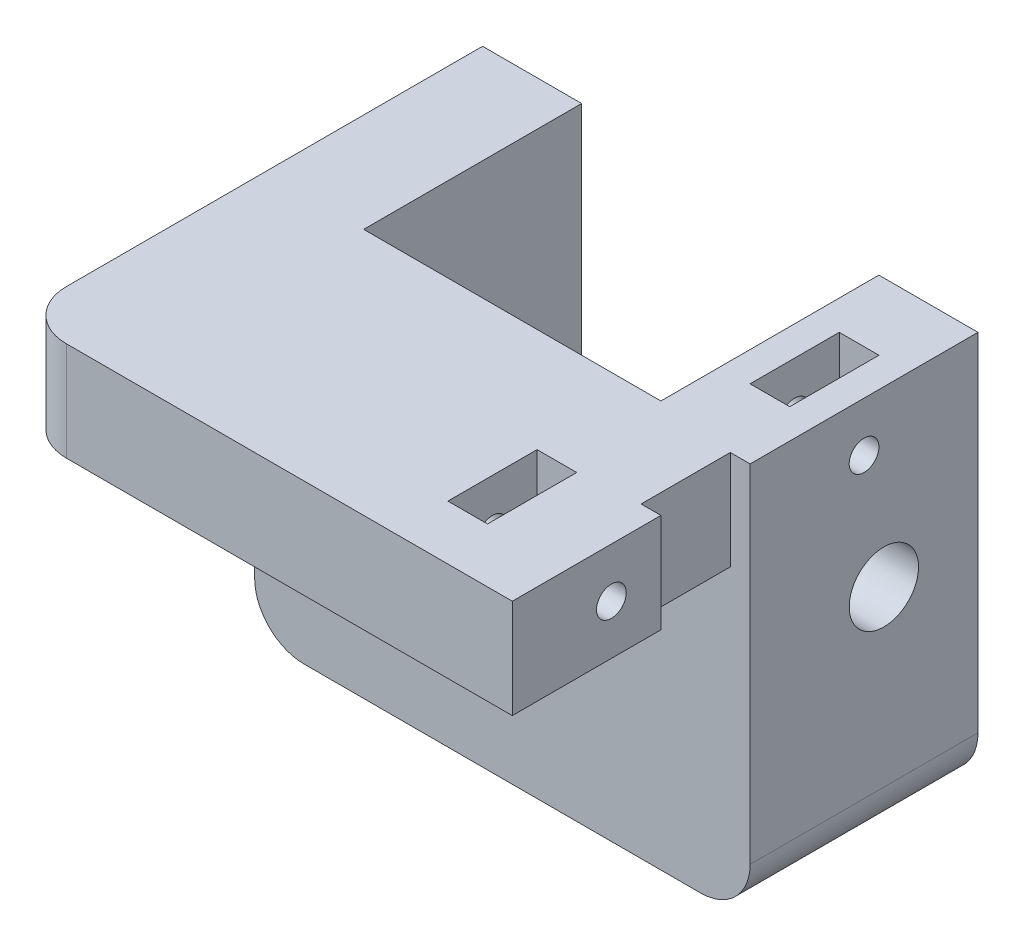
ISO-10303-21;
HEADER;
FILE_DESCRIPTION(('STEP AP214'),'2;1');
FILE_NAME('part.step','',(''),(''),'','','');
FILE_SCHEMA(('AUTOMOTIVE_DESIGN { 1 0 10303 214 1 1 1 1 }'));
ENDSEC;
DATA;
#1=APPLICATION_CONTEXT('core data for automotive mechanical design processes');
#2=APPLICATION_PROTOCOL_DEFINITION('international standard','automotive_design',2000,#1);
#3=PRODUCT_CONTEXT('',#1,'mechanical');
#4=PRODUCT('Part','Part','',(#3));
#5=PRODUCT_RELATED_PRODUCT_CATEGORY('part','',(#4));
#6=PRODUCT_DEFINITION_FORMATION('','',#4);
#7=PRODUCT_DEFINITION_CONTEXT('part definition',#1,'design');
#8=PRODUCT_DEFINITION('design','',#6,#7);
#9=PRODUCT_DEFINITION_SHAPE('','',#8);
#10=(LENGTH_UNIT() NAMED_UNIT(*) SI_UNIT(.MILLI.,.METRE.));
#11=(NAMED_UNIT(*) PLANE_ANGLE_UNIT() SI_UNIT($,.RADIAN.));
#12=(NAMED_UNIT(*) SI_UNIT($,.STERADIAN.) SOLID_ANGLE_UNIT());
#13=UNCERTAINTY_MEASURE_WITH_UNIT(LENGTH_MEASURE(1.E-05),#10,'distance_accuracy_value','');
#14=(GEOMETRIC_REPRESENTATION_CONTEXT(3) GLOBAL_UNCERTAINTY_ASSIGNED_CONTEXT((#13)) GLOBAL_UNIT_ASSIGNED_CONTEXT((#10,
#11,#12)) REPRESENTATION_CONTEXT('',''));
#15=CARTESIAN_POINT('',(0.,0.,0.));
#16=DIRECTION('',(0.,0.,1.));
#17=DIRECTION('',(1.,0.,0.));
#18=AXIS2_PLACEMENT_3D('',#15,#16,#17);
#19=CARTESIAN_POINT('',(21.,25.,11.5));
#20=DIRECTION('',(1.,0.,0.));
#21=DIRECTION('',(0.,0.,-1.));
#22=AXIS2_PLACEMENT_3D('',#19,#20,#21);
#23=CYLINDRICAL_SURFACE('',#22,1.5);
#24=CARTESIAN_POINT('',(37.0024157262878,25.,11.5));
#25=DIRECTION('',(1.,0.,0.));
#26=DIRECTION('',(0.,0.,-1.));
#27=AXIS2_PLACEMENT_3D('',#24,#25,#26);
#28=CIRCLE('',#27,1.5);
#29=CARTESIAN_POINT('',(37.0024157262878,25.,10.));
#30=VERTEX_POINT('',#29);
#31=EDGE_CURVE('E36',#30,#30,#28,.F.);
#32=ORIENTED_EDGE('',*,*,#31,.T.);
#33=EDGE_LOOP('',(#32));
#34=FACE_BOUND('',#33,.T.);
#35=CARTESIAN_POINT('',(40.,25.,11.5));
#36=DIRECTION('',(1.,0.,0.));
#37=DIRECTION('',(0.,0.,-1.));
#38=AXIS2_PLACEMENT_3D('',#35,#36,#37);
#39=CIRCLE('',#38,1.5);
#40=CARTESIAN_POINT('',(40.,25.,10.));
#41=VERTEX_POINT('',#40);
#42=EDGE_CURVE('E234',#41,#41,#39,.T.);
#43=ORIENTED_EDGE('',*,*,#42,.T.);
#44=EDGE_LOOP('',(#43));
#45=FACE_BOUND('',#44,.T.);
#46=ADVANCED_FACE('F32',(#34,#45),#23,.F.);
#47=CARTESIAN_POINT('',(-5.,30.,42.));
#48=DIRECTION('',(0.,-1.,0.));
#49=DIRECTION('',(1.,0.,0.));
#50=AXIS2_PLACEMENT_3D('',#47,#48,#49);
#51=CYLINDRICAL_SURFACE('',#50,5.);
#52=DIRECTION('',(0.,1.,0.));
#53=VECTOR('',#52,1.);
#54=CARTESIAN_POINT('',(-10.,30.,42.));
#55=LINE('',#54,#53);
#56=CARTESIAN_POINT('',(-10.,20.,42.));
#57=VERTEX_POINT('',#56);
#58=CARTESIAN_POINT('',(-10.,30.,42.));
#59=VERTEX_POINT('',#58);
#60=EDGE_CURVE('E402',#57,#59,#55,.T.);
#61=ORIENTED_EDGE('',*,*,#60,.F.);
#62=CARTESIAN_POINT('',(-5.,20.,42.));
#63=DIRECTION('',(0.,1.,0.));
#64=DIRECTION('',(0.,0.,1.));
#65=AXIS2_PLACEMENT_3D('',#62,#63,#64);
#66=CIRCLE('',#65,5.);
#67=CARTESIAN_POINT('',(-5.,20.,47.));
#68=VERTEX_POINT('',#67);
#69=EDGE_CURVE('E41',#68,#57,#66,.F.);
#70=ORIENTED_EDGE('',*,*,#69,.F.);
#71=DIRECTION('',(0.,1.,0.));
#72=VECTOR('',#71,1.);
#73=CARTESIAN_POINT('',(-5.,30.,47.));
#74=LINE('',#73,#72);
#75=CARTESIAN_POINT('',(-5.,30.,47.));
#76=VERTEX_POINT('',#75);
#77=EDGE_CURVE('E405',#76,#68,#74,.F.);
#78=ORIENTED_EDGE('',*,*,#77,.F.);
#79=CARTESIAN_POINT('',(-5.,30.,42.));
#80=DIRECTION('',(0.,-1.,0.));
#81=DIRECTION('',(1.,0.,0.));
#82=AXIS2_PLACEMENT_3D('',#79,#80,#81);
#83=CIRCLE('',#82,5.);
#84=EDGE_CURVE('E11',#59,#76,#83,.F.);
#85=ORIENTED_EDGE('',*,*,#84,.F.);
#86=EDGE_LOOP('',(#61,#70,#78,#85));
#87=FACE_BOUND('',#86,.T.);
#88=ADVANCED_FACE('F34',(#87),#51,.T.);
#89=CARTESIAN_POINT('',(-5.,-5.,22.));
#90=DIRECTION('',(0.,0.,1.));
#91=DIRECTION('',(1.,0.,0.));
#92=AXIS2_PLACEMENT_3D('',#89,#90,#91);
#93=CYLINDRICAL_SURFACE('',#92,5.);
#94=DIRECTION('',(0.,0.,1.));
#95=VECTOR('',#94,1.);
#96=CARTESIAN_POINT('',(-9.99999999999999,-5.,22.));
#97=LINE('',#96,#95);
#98=CARTESIAN_POINT('',(-9.99999999999999,-5.,0.));
#99=VERTEX_POINT('',#98);
#100=CARTESIAN_POINT('',(-9.99999999999999,-5.00000000000001,23.));
#101=VERTEX_POINT('',#100);
#102=EDGE_CURVE('E392',#99,#101,#97,.T.);
#103=ORIENTED_EDGE('',*,*,#102,.F.);
#104=CARTESIAN_POINT('',(-5.,-5.,0.));
#105=DIRECTION('',(0.,0.,1.));
#106=DIRECTION('',(1.,0.,0.));
#107=AXIS2_PLACEMENT_3D('',#104,#105,#106);
#108=CIRCLE('',#107,5.);
#109=CARTESIAN_POINT('',(-5.,-10.,0.));
#110=VERTEX_POINT('',#109);
#111=EDGE_CURVE('E398',#110,#99,#108,.F.);
#112=ORIENTED_EDGE('',*,*,#111,.F.);
#113=DIRECTION('',(0.,0.,1.));
#114=VECTOR('',#113,1.);
#115=CARTESIAN_POINT('',(-5.,-10.,22.));
#116=LINE('',#115,#114);
#117=CARTESIAN_POINT('',(-4.99999999999998,-10.,23.));
#118=VERTEX_POINT('',#117);
#119=EDGE_CURVE('E395',#118,#110,#116,.F.);
#120=ORIENTED_EDGE('',*,*,#119,.F.);
#121=CARTESIAN_POINT('',(-5.,-5.,23.));
#122=DIRECTION('',(0.,0.,-1.));
#123=DIRECTION('',(-1.,0.,0.));
#124=AXIS2_PLACEMENT_3D('',#121,#122,#123);
#125=CIRCLE('',#124,5.);
#126=EDGE_CURVE('E400',#101,#118,#125,.F.);
#127=ORIENTED_EDGE('',*,*,#126,.F.);
#128=EDGE_LOOP('',(#103,#112,#120,#127));
#129=FACE_BOUND('',#128,.T.);
#130=ADVANCED_FACE('F437',(#129),#93,.T.);
#131=CARTESIAN_POINT('',(35.,-5.00000000000001,22.));
#132=DIRECTION('',(0.,0.,-1.));
#133=DIRECTION('',(-1.,0.,0.));
#134=AXIS2_PLACEMENT_3D('',#131,#132,#133);
#135=CYLINDRICAL_SURFACE('',#134,5.);
#136=DIRECTION('',(0.,0.,-1.));
#137=VECTOR('',#136,1.);
#138=CARTESIAN_POINT('',(40.,-5.00000000000001,22.));
#139=LINE('',#138,#137);
#140=CARTESIAN_POINT('',(40.,-5.00000000000001,23.));
#141=VERTEX_POINT('',#140);
#142=CARTESIAN_POINT('',(40.,-5.00000000000001,0.));
#143=VERTEX_POINT('',#142);
#144=EDGE_CURVE('E377',#141,#143,#139,.T.);
#145=ORIENTED_EDGE('',*,*,#144,.F.);
#146=CARTESIAN_POINT('',(35.,-5.00000000000001,23.));
#147=DIRECTION('',(0.,0.,-1.));
#148=DIRECTION('',(-1.,0.,0.));
#149=AXIS2_PLACEMENT_3D('',#146,#147,#148);
#150=CIRCLE('',#149,5.);
#151=CARTESIAN_POINT('',(35.,-10.,23.));
#152=VERTEX_POINT('',#151);
#153=EDGE_CURVE('E387',#152,#141,#150,.F.);
#154=ORIENTED_EDGE('',*,*,#153,.F.);
#155=DIRECTION('',(0.,0.,-1.));
#156=VECTOR('',#155,1.);
#157=CARTESIAN_POINT('',(35.,-10.,22.));
#158=LINE('',#157,#156);
#159=CARTESIAN_POINT('',(35.,-10.,0.));
#160=VERTEX_POINT('',#159);
#161=EDGE_CURVE('E384',#160,#152,#158,.F.);
#162=ORIENTED_EDGE('',*,*,#161,.F.);
#163=CARTESIAN_POINT('',(35.,-5.00000000000001,0.));
#164=DIRECTION('',(0.,0.,1.));
#165=DIRECTION('',(1.,0.,0.));
#166=AXIS2_PLACEMENT_3D('',#163,#164,#165);
#167=CIRCLE('',#166,5.);
#168=EDGE_CURVE('E389',#143,#160,#167,.F.);
#169=ORIENTED_EDGE('',*,*,#168,.F.);
#170=EDGE_LOOP('',(#145,#154,#162,#169));
#171=FACE_BOUND('',#170,.T.);
#172=ADVANCED_FACE('F526',(#171),#135,.T.);
#173=CARTESIAN_POINT('',(25.,25.,37.));
#174=DIRECTION('',(1.,0.,0.));
#175=DIRECTION('',(0.,0.,-1.));
#176=AXIS2_PLACEMENT_3D('',#173,#174,#175);
#177=CYLINDRICAL_SURFACE('',#176,1.5);
#178=CARTESIAN_POINT('',(32.,25.,37.));
#179=DIRECTION('',(1.,0.,0.));
#180=DIRECTION('',(0.,0.,-1.));
#181=AXIS2_PLACEMENT_3D('',#178,#179,#180);
#182=CIRCLE('',#181,1.5);
#183=CARTESIAN_POINT('',(32.,25.,35.5));
#184=VERTEX_POINT('',#183);
#185=EDGE_CURVE('E272',#184,#184,#182,.F.);
#186=ORIENTED_EDGE('',*,*,#185,.T.);
#187=EDGE_LOOP('',(#186));
#188=FACE_BOUND('',#187,.T.);
#189=CARTESIAN_POINT('',(40.,25.,37.));
#190=DIRECTION('',(1.,0.,0.));
#191=DIRECTION('',(0.,0.,-1.));
#192=AXIS2_PLACEMENT_3D('',#189,#190,#191);
#193=CIRCLE('',#192,1.5);
#194=CARTESIAN_POINT('',(40.,25.,35.5));
#195=VERTEX_POINT('',#194);
#196=EDGE_CURVE('E282',#195,#195,#193,.T.);
#197=ORIENTED_EDGE('',*,*,#196,.T.);
#198=EDGE_LOOP('',(#197));
#199=FACE_BOUND('',#198,.T.);
#200=ADVANCED_FACE('F469',(#188,#199),#177,.F.);
#201=CARTESIAN_POINT('',(-10.,20.,47.));
#202=DIRECTION('',(0.,1.,0.));
#203=DIRECTION('',(0.,0.,1.));
#204=AXIS2_PLACEMENT_3D('',#201,#202,#203);
#205=PLANE('',#204);
#206=DIRECTION('',(1.,0.,0.));
#207=VECTOR('',#206,1.);
#208=CARTESIAN_POINT('',(-10.,20.,41.5));
#209=LINE('',#208,#207);
#210=CARTESIAN_POINT('',(28.,20.,41.5));
#211=VERTEX_POINT('',#210);
#212=CARTESIAN_POINT('',(32.,20.,41.5));
#213=VERTEX_POINT('',#212);
#214=EDGE_CURVE('E279',#211,#213,#209,.T.);
#215=ORIENTED_EDGE('',*,*,#214,.T.);
#216=DIRECTION('',(0.,0.,-1.));
#217=VECTOR('',#216,1.);
#218=CARTESIAN_POINT('',(32.,20.,47.));
#219=LINE('',#218,#217);
#220=CARTESIAN_POINT('',(32.,20.,32.5));
#221=VERTEX_POINT('',#220);
#222=EDGE_CURVE('E273',#213,#221,#219,.T.);
#223=ORIENTED_EDGE('',*,*,#222,.T.);
#224=DIRECTION('',(-1.,0.,0.));
#225=VECTOR('',#224,1.);
#226=CARTESIAN_POINT('',(-10.,20.,32.5));
#227=LINE('',#226,#225);
#228=CARTESIAN_POINT('',(28.,20.,32.5));
#229=VERTEX_POINT('',#228);
#230=EDGE_CURVE('E276',#221,#229,#227,.T.);
#231=ORIENTED_EDGE('',*,*,#230,.T.);
#232=DIRECTION('',(0.,0.,1.));
#233=VECTOR('',#232,1.);
#234=CARTESIAN_POINT('',(28.,20.,47.));
#235=LINE('',#234,#233);
#236=EDGE_CURVE('E269',#229,#211,#235,.T.);
#237=ORIENTED_EDGE('',*,*,#236,.T.);
#238=EDGE_LOOP('',(#215,#223,#231,#237));
#239=FACE_BOUND('',#238,.T.);
#240=DIRECTION('',(1.,0.,0.));
#241=VECTOR('',#240,1.);
#242=CARTESIAN_POINT('',(-10.,20.,47.));
#243=LINE('',#242,#241);
#244=CARTESIAN_POINT('',(40.,20.,47.));
#245=VERTEX_POINT('',#244);
#246=EDGE_CURVE('E328',#68,#245,#243,.T.);
#247=ORIENTED_EDGE('',*,*,#246,.F.);
#248=ORIENTED_EDGE('',*,*,#69,.T.);
#249=DIRECTION('',(0.,0.,-1.));
#250=VECTOR('',#249,1.);
#251=CARTESIAN_POINT('',(-10.,20.,47.));
#252=LINE('',#251,#250);
#253=CARTESIAN_POINT('',(-10.,20.,23.));
#254=VERTEX_POINT('',#253);
#255=EDGE_CURVE('E333',#57,#254,#252,.T.);
#256=ORIENTED_EDGE('',*,*,#255,.T.);
#257=DIRECTION('',(-1.,0.,0.));
#258=VECTOR('',#257,1.);
#259=CARTESIAN_POINT('',(-10.,20.,23.));
#260=LINE('',#259,#258);
#261=CARTESIAN_POINT('',(38.,20.,23.));
#262=VERTEX_POINT('',#261);
#263=EDGE_CURVE('E301',#262,#254,#260,.T.);
#264=ORIENTED_EDGE('',*,*,#263,.F.);
#265=DIRECTION('',(0.,0.,-1.));
#266=VECTOR('',#265,1.);
#267=CARTESIAN_POINT('',(38.,20.,22.));
#268=LINE('',#267,#266);
#269=CARTESIAN_POINT('',(38.,20.,32.));
#270=VERTEX_POINT('',#269);
#271=EDGE_CURVE('E307',#270,#262,#268,.T.);
#272=ORIENTED_EDGE('',*,*,#271,.F.);
#273=DIRECTION('',(-1.,0.,0.));
#274=VECTOR('',#273,1.);
#275=CARTESIAN_POINT('',(40.,20.,32.));
#276=LINE('',#275,#274);
#277=CARTESIAN_POINT('',(40.,20.,32.));
#278=VERTEX_POINT('',#277);
#279=EDGE_CURVE('E304',#278,#270,#276,.T.);
#280=ORIENTED_EDGE('',*,*,#279,.F.);
#281=DIRECTION('',(0.,0.,-1.));
#282=VECTOR('',#281,1.);
#283=CARTESIAN_POINT('',(40.,20.,22.));
#284=LINE('',#283,#282);
#285=EDGE_CURVE('E322',#245,#278,#284,.T.);
#286=ORIENTED_EDGE('',*,*,#285,.F.);
#287=EDGE_LOOP('',(#247,#248,#256,#264,#272,#280,#286));
#288=FACE_BOUND('',#287,.T.);
#289=ADVANCED_FACE('F478',(#239,#288),#205,.F.);
#290=CARTESIAN_POINT('',(38.,60.,22.));
#291=DIRECTION('',(-1.,0.,0.));
#292=DIRECTION('',(0.,0.,1.));
#293=AXIS2_PLACEMENT_3D('',#290,#291,#292);
#294=PLANE('',#293);
#295=DIRECTION('',(0.,-1.,0.));
#296=VECTOR('',#295,1.);
#297=CARTESIAN_POINT('',(38.,20.,23.));
#298=LINE('',#297,#296);
#299=CARTESIAN_POINT('',(38.,30.,23.));
#300=VERTEX_POINT('',#299);
#301=EDGE_CURVE('E298',#300,#262,#298,.T.);
#302=ORIENTED_EDGE('',*,*,#301,.F.);
#303=DIRECTION('',(0.,0.,-1.));
#304=VECTOR('',#303,1.);
#305=CARTESIAN_POINT('',(38.,30.,22.));
#306=LINE('',#305,#304);
#307=CARTESIAN_POINT('',(38.,30.,32.));
#308=VERTEX_POINT('',#307);
#309=EDGE_CURVE('E316',#308,#300,#306,.T.);
#310=ORIENTED_EDGE('',*,*,#309,.F.);
#311=DIRECTION('',(0.,-1.,0.));
#312=VECTOR('',#311,1.);
#313=CARTESIAN_POINT('',(38.,60.,32.));
#314=LINE('',#313,#312);
#315=EDGE_CURVE('E310',#308,#270,#314,.T.);
#316=ORIENTED_EDGE('',*,*,#315,.T.);
#317=ORIENTED_EDGE('',*,*,#271,.T.);
#318=EDGE_LOOP('',(#302,#310,#316,#317));
#319=FACE_BOUND('',#318,.T.);
#320=ADVANCED_FACE('F474',(#319),#294,.F.);
#321=CARTESIAN_POINT('',(40.,-10.,22.));
#322=DIRECTION('',(-1.,0.,0.));
#323=DIRECTION('',(0.,0.,1.));
#324=AXIS2_PLACEMENT_3D('',#321,#322,#323);
#325=PLANE('',#324);
#326=ORIENTED_EDGE('',*,*,#42,.F.);
#327=EDGE_LOOP('',(#326));
#328=FACE_BOUND('',#327,.T.);
#329=CARTESIAN_POINT('',(40.,12.5,9.5));
#330=DIRECTION('',(1.,0.,0.));
#331=DIRECTION('',(0.,0.,-1.));
#332=AXIS2_PLACEMENT_3D('',#329,#330,#331);
#333=CIRCLE('',#332,3.5);
#334=CARTESIAN_POINT('',(40.,12.5,6.));
#335=VERTEX_POINT('',#334);
#336=EDGE_CURVE('E238',#335,#335,#333,.T.);
#337=ORIENTED_EDGE('',*,*,#336,.F.);
#338=EDGE_LOOP('',(#337));
#339=FACE_BOUND('',#338,.T.);
#340=DIRECTION('',(0.,1.,0.));
#341=VECTOR('',#340,1.);
#342=CARTESIAN_POINT('',(40.,30.,23.));
#343=LINE('',#342,#341);
#344=CARTESIAN_POINT('',(40.,30.,23.));
#345=VERTEX_POINT('',#344);
#346=EDGE_CURVE('E293',#141,#345,#343,.T.);
#347=ORIENTED_EDGE('',*,*,#346,.F.);
#348=ORIENTED_EDGE('',*,*,#144,.T.);
#349=DIRECTION('',(0.,1.,0.));
#350=VECTOR('',#349,1.);
#351=CARTESIAN_POINT('',(40.,-10.,0.));
#352=LINE('',#351,#350);
#353=CARTESIAN_POINT('',(40.,30.,0.));
#354=VERTEX_POINT('',#353);
#355=EDGE_CURVE('E354',#143,#354,#352,.T.);
#356=ORIENTED_EDGE('',*,*,#355,.T.);
#357=DIRECTION('',(0.,0.,-1.));
#358=VECTOR('',#357,1.);
#359=CARTESIAN_POINT('',(40.,30.,22.));
#360=LINE('',#359,#358);
#361=EDGE_CURVE('E369',#345,#354,#360,.T.);
#362=ORIENTED_EDGE('',*,*,#361,.F.);
#363=EDGE_LOOP('',(#347,#348,#356,#362));
#364=FACE_BOUND('',#363,.T.);
#365=ADVANCED_FACE('F477',(#328,#339,#364),#325,.F.);
#366=CARTESIAN_POINT('',(0.,0.,22.));
#367=DIRECTION('',(-1.,0.,0.));
#368=DIRECTION('',(0.,0.,1.));
#369=AXIS2_PLACEMENT_3D('',#366,#367,#368);
#370=PLANE('',#369);
#371=CARTESIAN_POINT('',(0.,12.5,9.5));
#372=DIRECTION('',(-1.,0.,0.));
#373=DIRECTION('',(0.,0.,1.));
#374=AXIS2_PLACEMENT_3D('',#371,#372,#373);
#375=CIRCLE('',#374,3.5);
#376=CARTESIAN_POINT('',(0.,12.5,13.));
#377=VERTEX_POINT('',#376);
#378=EDGE_CURVE('E245',#377,#377,#375,.T.);
#379=ORIENTED_EDGE('',*,*,#378,.T.);
#380=EDGE_LOOP('',(#379));
#381=FACE_BOUND('',#380,.T.);
#382=DIRECTION('',(0.,0.,-1.));
#383=VECTOR('',#382,1.);
#384=CARTESIAN_POINT('',(0.,30.,22.));
#385=LINE('',#384,#383);
#386=CARTESIAN_POINT('',(0.,30.,22.));
#387=VERTEX_POINT('',#386);
#388=CARTESIAN_POINT('',(0.,30.,0.));
#389=VERTEX_POINT('',#388);
#390=EDGE_CURVE('E375',#387,#389,#385,.T.);
#391=ORIENTED_EDGE('',*,*,#390,.F.);
#392=DIRECTION('',(0.,1.,0.));
#393=VECTOR('',#392,1.);
#394=CARTESIAN_POINT('',(0.,0.,22.));
#395=LINE('',#394,#393);
#396=CARTESIAN_POINT('',(0.,0.,22.));
#397=VERTEX_POINT('',#396);
#398=EDGE_CURVE('E336',#397,#387,#395,.T.);
#399=ORIENTED_EDGE('',*,*,#398,.F.);
#400=DIRECTION('',(0.,0.,-1.));
#401=VECTOR('',#400,1.);
#402=CARTESIAN_POINT('',(0.,0.,22.));
#403=LINE('',#402,#401);
#404=CARTESIAN_POINT('',(0.,0.,0.));
#405=VERTEX_POINT('',#404);
#406=EDGE_CURVE('E343',#397,#405,#403,.T.);
#407=ORIENTED_EDGE('',*,*,#406,.T.);
#408=DIRECTION('',(0.,1.,0.));
#409=VECTOR('',#408,1.);
#410=CARTESIAN_POINT('',(0.,0.,0.));
#411=LINE('',#410,#409);
#412=EDGE_CURVE('E335',#405,#389,#411,.T.);
#413=ORIENTED_EDGE('',*,*,#412,.T.);
#414=EDGE_LOOP('',(#391,#399,#407,#413));
#415=FACE_BOUND('',#414,.T.);
#416=ADVANCED_FACE('F521',(#381,#415),#370,.F.);
#417=CARTESIAN_POINT('',(-10.,30.,22.));
#418=DIRECTION('',(1.,0.,0.));
#419=DIRECTION('',(0.,1.,0.));
#420=AXIS2_PLACEMENT_3D('',#417,#418,#419);
#421=PLANE('',#420);
#422=CARTESIAN_POINT('',(-10.,12.5,9.5));
#423=DIRECTION('',(1.,0.,0.));
#424=DIRECTION('',(0.,1.,0.));
#425=AXIS2_PLACEMENT_3D('',#422,#423,#424);
#426=CIRCLE('',#425,3.5);
#427=CARTESIAN_POINT('',(-10.,16.,9.5));
#428=VERTEX_POINT('',#427);
#429=EDGE_CURVE('E242',#428,#428,#426,.T.);
#430=ORIENTED_EDGE('',*,*,#429,.T.);
#431=EDGE_LOOP('',(#430));
#432=FACE_BOUND('',#431,.T.);
#433=ORIENTED_EDGE('',*,*,#255,.F.);
#434=ORIENTED_EDGE('',*,*,#60,.T.);
#435=DIRECTION('',(0.,0.,-1.));
#436=VECTOR('',#435,1.);
#437=CARTESIAN_POINT('',(-10.,30.,22.));
#438=LINE('',#437,#436);
#439=CARTESIAN_POINT('',(-10.,30.,0.));
#440=VERTEX_POINT('',#439);
#441=EDGE_CURVE('E373',#59,#440,#438,.T.);
#442=ORIENTED_EDGE('',*,*,#441,.T.);
#443=DIRECTION('',(0.,-1.,0.));
#444=VECTOR('',#443,1.);
#445=CARTESIAN_POINT('',(-10.,30.,0.));
#446=LINE('',#445,#444);
#447=EDGE_CURVE('E349',#440,#99,#446,.T.);
#448=ORIENTED_EDGE('',*,*,#447,.T.);
#449=ORIENTED_EDGE('',*,*,#102,.T.);
#450=DIRECTION('',(0.,-1.,0.));
#451=VECTOR('',#450,1.);
#452=CARTESIAN_POINT('',(-9.99999999999999,-10.,23.));
#453=LINE('',#452,#451);
#454=EDGE_CURVE('E286',#254,#101,#453,.T.);
#455=ORIENTED_EDGE('',*,*,#454,.F.);
#456=EDGE_LOOP('',(#433,#434,#442,#448,#449,#455));
#457=FACE_BOUND('',#456,.T.);
#458=ADVANCED_FACE('F517',(#432,#457),#421,.F.);
#459=CARTESIAN_POINT('',(-9.99999999999999,-10.,22.));
#460=DIRECTION('',(0.,1.,0.));
#461=DIRECTION('',(0.,0.,1.));
#462=AXIS2_PLACEMENT_3D('',#459,#460,#461);
#463=PLANE('',#462);
#464=DIRECTION('',(1.,0.,0.));
#465=VECTOR('',#464,1.);
#466=CARTESIAN_POINT('',(40.,-10.,23.));
#467=LINE('',#466,#465);
#468=EDGE_CURVE('E291',#118,#152,#467,.T.);
#469=ORIENTED_EDGE('',*,*,#468,.F.);
#470=ORIENTED_EDGE('',*,*,#119,.T.);
#471=DIRECTION('',(1.,0.,0.));
#472=VECTOR('',#471,1.);
#473=CARTESIAN_POINT('',(-9.99999999999999,-10.,0.));
#474=LINE('',#473,#472);
#475=EDGE_CURVE('E352',#110,#160,#474,.T.);
#476=ORIENTED_EDGE('',*,*,#475,.T.);
#477=ORIENTED_EDGE('',*,*,#161,.T.);
#478=EDGE_LOOP('',(#469,#470,#476,#477));
#479=FACE_BOUND('',#478,.T.);
#480=ADVANCED_FACE('F513',(#479),#463,.F.);
#481=ORIENTED_EDGE('',*,*,#196,.F.);
#482=EDGE_LOOP('',(#481));
#483=FACE_BOUND('',#482,.T.);
#484=ORIENTED_EDGE('',*,*,#285,.T.);
#485=DIRECTION('',(0.,-1.,0.));
#486=VECTOR('',#485,1.);
#487=CARTESIAN_POINT('',(40.,60.,32.));
#488=LINE('',#487,#486);
#489=CARTESIAN_POINT('',(40.,30.,32.));
#490=VERTEX_POINT('',#489);
#491=EDGE_CURVE('E309',#490,#278,#488,.T.);
#492=ORIENTED_EDGE('',*,*,#491,.F.);
#493=CARTESIAN_POINT('',(40.,30.,47.));
#494=VERTEX_POINT('',#493);
#495=EDGE_CURVE('E370',#494,#490,#360,.T.);
#496=ORIENTED_EDGE('',*,*,#495,.F.);
#497=DIRECTION('',(0.,-1.,0.));
#498=VECTOR('',#497,1.);
#499=CARTESIAN_POINT('',(40.,20.,47.));
#500=LINE('',#499,#498);
#501=EDGE_CURVE('E319',#494,#245,#500,.T.);
#502=ORIENTED_EDGE('',*,*,#501,.T.);
#503=EDGE_LOOP('',(#484,#492,#496,#502));
#504=FACE_BOUND('',#503,.T.);
#505=ADVANCED_FACE('F509',(#483,#504),#325,.F.);
#506=CARTESIAN_POINT('',(40.,30.,22.));
#507=DIRECTION('',(0.,-1.,0.));
#508=DIRECTION('',(1.,0.,0.));
#509=AXIS2_PLACEMENT_3D('',#506,#507,#508);
#510=PLANE('',#509);
#511=DIRECTION('',(-1.,0.,0.));
#512=VECTOR('',#511,1.);
#513=CARTESIAN_POINT('',(37.0024157262878,30.,7.));
#514=LINE('',#513,#512);
#515=CARTESIAN_POINT('',(37.0024157262878,30.,7.));
#516=VERTEX_POINT('',#515);
#517=CARTESIAN_POINT('',(32.9975842737122,30.,7.));
#518=VERTEX_POINT('',#517);
#519=EDGE_CURVE('E224',#516,#518,#514,.T.);
#520=ORIENTED_EDGE('',*,*,#519,.F.);
#521=DIRECTION('',(0.,0.,-1.));
#522=VECTOR('',#521,1.);
#523=CARTESIAN_POINT('',(37.0024157262878,30.,16.));
#524=LINE('',#523,#522);
#525=CARTESIAN_POINT('',(37.0024157262878,30.,16.));
#526=VERTEX_POINT('',#525);
#527=EDGE_CURVE('E49',#526,#516,#524,.T.);
#528=ORIENTED_EDGE('',*,*,#527,.F.);
#529=DIRECTION('',(1.,0.,0.));
#530=VECTOR('',#529,1.);
#531=CARTESIAN_POINT('',(37.0024157262878,30.,16.));
#532=LINE('',#531,#530);
#533=CARTESIAN_POINT('',(32.9975842737122,30.,16.));
#534=VERTEX_POINT('',#533);
#535=EDGE_CURVE('E215',#534,#526,#532,.T.);
#536=ORIENTED_EDGE('',*,*,#535,.F.);
#537=DIRECTION('',(0.,0.,1.));
#538=VECTOR('',#537,1.);
#539=CARTESIAN_POINT('',(32.9975842737122,30.,16.));
#540=LINE('',#539,#538);
#541=EDGE_CURVE('E218',#518,#534,#540,.T.);
#542=ORIENTED_EDGE('',*,*,#541,.F.);
#543=EDGE_LOOP('',(#520,#528,#536,#542));
#544=FACE_BOUND('',#543,.T.);
#545=DIRECTION('',(-1.,0.,0.));
#546=VECTOR('',#545,1.);
#547=CARTESIAN_POINT('',(32.,30.,32.5));
#548=LINE('',#547,#546);
#549=CARTESIAN_POINT('',(32.,30.,32.5));
#550=VERTEX_POINT('',#549);
#551=CARTESIAN_POINT('',(28.,30.,32.5));
#552=VERTEX_POINT('',#551);
#553=EDGE_CURVE('E250',#550,#552,#548,.T.);
#554=ORIENTED_EDGE('',*,*,#553,.F.);
#555=DIRECTION('',(0.,0.,-1.));
#556=VECTOR('',#555,1.);
#557=CARTESIAN_POINT('',(32.,30.,32.5));
#558=LINE('',#557,#556);
#559=CARTESIAN_POINT('',(32.,30.,41.5));
#560=VERTEX_POINT('',#559);
#561=EDGE_CURVE('E248',#560,#550,#558,.T.);
#562=ORIENTED_EDGE('',*,*,#561,.F.);
#563=DIRECTION('',(1.,0.,0.));
#564=VECTOR('',#563,1.);
#565=CARTESIAN_POINT('',(32.,30.,41.5));
#566=LINE('',#565,#564);
#567=CARTESIAN_POINT('',(28.,30.,41.5));
#568=VERTEX_POINT('',#567);
#569=EDGE_CURVE('E256',#568,#560,#566,.T.);
#570=ORIENTED_EDGE('',*,*,#569,.F.);
#571=DIRECTION('',(0.,0.,1.));
#572=VECTOR('',#571,1.);
#573=CARTESIAN_POINT('',(28.,30.,32.5));
#574=LINE('',#573,#572);
#575=EDGE_CURVE('E253',#552,#568,#574,.T.);
#576=ORIENTED_EDGE('',*,*,#575,.F.);
#577=EDGE_LOOP('',(#554,#562,#570,#576));
#578=FACE_BOUND('',#577,.T.);
#579=ORIENTED_EDGE('',*,*,#441,.F.);
#580=ORIENTED_EDGE('',*,*,#84,.T.);
#581=DIRECTION('',(-1.,0.,0.));
#582=VECTOR('',#581,1.);
#583=CARTESIAN_POINT('',(-10.,30.,47.));
#584=LINE('',#583,#582);
#585=EDGE_CURVE('E330',#494,#76,#584,.T.);
#586=ORIENTED_EDGE('',*,*,#585,.F.);
#587=ORIENTED_EDGE('',*,*,#495,.T.);
#588=DIRECTION('',(-1.,0.,0.));
#589=VECTOR('',#588,1.);
#590=CARTESIAN_POINT('',(40.,30.,32.));
#591=LINE('',#590,#589);
#592=EDGE_CURVE('E312',#490,#308,#591,.T.);
#593=ORIENTED_EDGE('',*,*,#592,.T.);
#594=ORIENTED_EDGE('',*,*,#309,.T.);
#595=DIRECTION('',(-1.,0.,0.));
#596=VECTOR('',#595,1.);
#597=CARTESIAN_POINT('',(38.,30.,23.));
#598=LINE('',#597,#596);
#599=EDGE_CURVE('E295',#345,#300,#598,.T.);
#600=ORIENTED_EDGE('',*,*,#599,.F.);
#601=ORIENTED_EDGE('',*,*,#361,.T.);
#602=DIRECTION('',(-1.,0.,0.));
#603=VECTOR('',#602,1.);
#604=CARTESIAN_POINT('',(40.,30.,0.));
#605=LINE('',#604,#603);
#606=CARTESIAN_POINT('',(30.,30.,0.));
#607=VERTEX_POINT('',#606);
#608=EDGE_CURVE('E356',#354,#607,#605,.T.);
#609=ORIENTED_EDGE('',*,*,#608,.T.);
#610=DIRECTION('',(0.,0.,-1.));
#611=VECTOR('',#610,1.);
#612=CARTESIAN_POINT('',(30.,30.,22.));
#613=LINE('',#612,#611);
#614=CARTESIAN_POINT('',(30.,30.,22.));
#615=VERTEX_POINT('',#614);
#616=EDGE_CURVE('E366',#615,#607,#613,.T.);
#617=ORIENTED_EDGE('',*,*,#616,.F.);
#618=DIRECTION('',(-1.,0.,0.));
#619=VECTOR('',#618,1.);
#620=CARTESIAN_POINT('',(40.,30.,22.));
#621=LINE('',#620,#619);
#622=EDGE_CURVE('E325',#615,#387,#621,.T.);
#623=ORIENTED_EDGE('',*,*,#622,.T.);
#624=ORIENTED_EDGE('',*,*,#390,.T.);
#625=DIRECTION('',(-1.,0.,0.));
#626=VECTOR('',#625,1.);
#627=CARTESIAN_POINT('',(0.,30.,0.));
#628=LINE('',#627,#626);
#629=EDGE_CURVE('E346',#389,#440,#628,.T.);
#630=ORIENTED_EDGE('',*,*,#629,.T.);
#631=EDGE_LOOP('',(#579,#580,#586,#587,#593,#594,#600,#601,#609,#617,#623,#624,#630));
#632=FACE_BOUND('',#631,.T.);
#633=ADVANCED_FACE('F505',(#544,#578,#632),#510,.F.);
#634=CARTESIAN_POINT('',(30.,0.,22.));
#635=DIRECTION('',(1.,0.,0.));
#636=DIRECTION('',(0.,0.,-1.));
#637=AXIS2_PLACEMENT_3D('',#634,#635,#636);
#638=PLANE('',#637);
#639=CARTESIAN_POINT('',(30.,25.,11.5));
#640=DIRECTION('',(1.,0.,0.));
#641=DIRECTION('',(0.,0.,-1.));
#642=AXIS2_PLACEMENT_3D('',#639,#640,#641);
#643=CIRCLE('',#642,1.5);
#644=CARTESIAN_POINT('',(30.,25.,10.));
#645=VERTEX_POINT('',#644);
#646=EDGE_CURVE('E237',#645,#645,#643,.T.);
#647=ORIENTED_EDGE('',*,*,#646,.T.);
#648=EDGE_LOOP('',(#647));
#649=FACE_BOUND('',#648,.T.);
#650=CARTESIAN_POINT('',(30.,12.5,9.5));
#651=DIRECTION('',(1.,0.,0.));
#652=DIRECTION('',(0.,0.,-1.));
#653=AXIS2_PLACEMENT_3D('',#650,#651,#652);
#654=CIRCLE('',#653,3.5);
#655=CARTESIAN_POINT('',(30.,12.5,6.));
#656=VERTEX_POINT('',#655);
#657=EDGE_CURVE('E241',#656,#656,#654,.T.);
#658=ORIENTED_EDGE('',*,*,#657,.T.);
#659=EDGE_LOOP('',(#658));
#660=FACE_BOUND('',#659,.T.);
#661=DIRECTION('',(0.,-1.,0.));
#662=VECTOR('',#661,1.);
#663=CARTESIAN_POINT('',(30.,0.,0.));
#664=LINE('',#663,#662);
#665=CARTESIAN_POINT('',(30.,0.,0.));
#666=VERTEX_POINT('',#665);
#667=EDGE_CURVE('E358',#607,#666,#664,.T.);
#668=ORIENTED_EDGE('',*,*,#667,.T.);
#669=DIRECTION('',(0.,0.,-1.));
#670=VECTOR('',#669,1.);
#671=CARTESIAN_POINT('',(30.,0.,22.));
#672=LINE('',#671,#670);
#673=CARTESIAN_POINT('',(30.,0.,22.));
#674=VERTEX_POINT('',#673);
#675=EDGE_CURVE('E363',#674,#666,#672,.T.);
#676=ORIENTED_EDGE('',*,*,#675,.F.);
#677=DIRECTION('',(0.,-1.,0.));
#678=VECTOR('',#677,1.);
#679=CARTESIAN_POINT('',(30.,0.,22.));
#680=LINE('',#679,#678);
#681=EDGE_CURVE('E338',#615,#674,#680,.T.);
#682=ORIENTED_EDGE('',*,*,#681,.F.);
#683=ORIENTED_EDGE('',*,*,#616,.T.);
#684=EDGE_LOOP('',(#668,#676,#682,#683));
#685=FACE_BOUND('',#684,.T.);
#686=ADVANCED_FACE('F501',(#649,#660,#685),#638,.F.);
#687=CARTESIAN_POINT('',(0.,0.,22.));
#688=DIRECTION('',(0.,-1.,0.));
#689=DIRECTION('',(0.,0.,-1.));
#690=AXIS2_PLACEMENT_3D('',#687,#688,#689);
#691=PLANE('',#690);
#692=DIRECTION('',(-1.,0.,0.));
#693=VECTOR('',#692,1.);
#694=CARTESIAN_POINT('',(0.,0.,0.));
#695=LINE('',#694,#693);
#696=EDGE_CURVE('E339',#666,#405,#695,.T.);
#697=ORIENTED_EDGE('',*,*,#696,.T.);
#698=ORIENTED_EDGE('',*,*,#406,.F.);
#699=DIRECTION('',(-1.,0.,0.));
#700=VECTOR('',#699,1.);
#701=CARTESIAN_POINT('',(0.,0.,22.));
#702=LINE('',#701,#700);
#703=EDGE_CURVE('E341',#674,#397,#702,.T.);
#704=ORIENTED_EDGE('',*,*,#703,.F.);
#705=ORIENTED_EDGE('',*,*,#675,.T.);
#706=EDGE_LOOP('',(#697,#698,#704,#705));
#707=FACE_BOUND('',#706,.T.);
#708=ADVANCED_FACE('F497',(#707),#691,.F.);
#709=CARTESIAN_POINT('',(0.,0.,0.));
#710=DIRECTION('',(0.,0.,1.));
#711=DIRECTION('',(1.,0.,0.));
#712=AXIS2_PLACEMENT_3D('',#709,#710,#711);
#713=PLANE('',#712);
#714=ORIENTED_EDGE('',*,*,#475,.F.);
#715=ORIENTED_EDGE('',*,*,#111,.T.);
#716=ORIENTED_EDGE('',*,*,#447,.F.);
#717=ORIENTED_EDGE('',*,*,#629,.F.);
#718=ORIENTED_EDGE('',*,*,#412,.F.);
#719=ORIENTED_EDGE('',*,*,#696,.F.);
#720=ORIENTED_EDGE('',*,*,#667,.F.);
#721=ORIENTED_EDGE('',*,*,#608,.F.);
#722=ORIENTED_EDGE('',*,*,#355,.F.);
#723=ORIENTED_EDGE('',*,*,#168,.T.);
#724=EDGE_LOOP('',(#714,#715,#716,#717,#718,#719,#720,#721,#722,#723));
#725=FACE_BOUND('',#724,.T.);
#726=ADVANCED_FACE('F490',(#725),#713,.F.);
#727=CARTESIAN_POINT('',(0.,0.,47.));
#728=DIRECTION('',(0.,0.,1.));
#729=DIRECTION('',(1.,0.,0.));
#730=AXIS2_PLACEMENT_3D('',#727,#728,#729);
#731=PLANE('',#730);
#732=ORIENTED_EDGE('',*,*,#585,.T.);
#733=ORIENTED_EDGE('',*,*,#77,.T.);
#734=ORIENTED_EDGE('',*,*,#246,.T.);
#735=ORIENTED_EDGE('',*,*,#501,.F.);
#736=EDGE_LOOP('',(#732,#733,#734,#735));
#737=FACE_BOUND('',#736,.T.);
#738=ADVANCED_FACE('F486',(#737),#731,.T.);
#739=CARTESIAN_POINT('',(40.,20.,22.));
#740=DIRECTION('',(0.,0.,1.));
#741=DIRECTION('',(1.,0.,0.));
#742=AXIS2_PLACEMENT_3D('',#739,#740,#741);
#743=PLANE('',#742);
#744=ORIENTED_EDGE('',*,*,#622,.F.);
#745=ORIENTED_EDGE('',*,*,#681,.T.);
#746=ORIENTED_EDGE('',*,*,#703,.T.);
#747=ORIENTED_EDGE('',*,*,#398,.T.);
#748=EDGE_LOOP('',(#744,#745,#746,#747));
#749=FACE_BOUND('',#748,.T.);
#750=ADVANCED_FACE('F482',(#749),#743,.F.);
#751=CARTESIAN_POINT('',(40.,60.,32.));
#752=DIRECTION('',(0.,0.,1.));
#753=DIRECTION('',(1.,0.,0.));
#754=AXIS2_PLACEMENT_3D('',#751,#752,#753);
#755=PLANE('',#754);
#756=ORIENTED_EDGE('',*,*,#491,.T.);
#757=ORIENTED_EDGE('',*,*,#279,.T.);
#758=ORIENTED_EDGE('',*,*,#315,.F.);
#759=ORIENTED_EDGE('',*,*,#592,.F.);
#760=EDGE_LOOP('',(#756,#757,#758,#759));
#761=FACE_BOUND('',#760,.T.);
#762=ADVANCED_FACE('F472',(#761),#755,.F.);
#763=CARTESIAN_POINT('',(0.,0.,23.));
#764=DIRECTION('',(0.,0.,-1.));
#765=DIRECTION('',(-1.,0.,0.));
#766=AXIS2_PLACEMENT_3D('',#763,#764,#765);
#767=PLANE('',#766);
#768=ORIENTED_EDGE('',*,*,#454,.T.);
#769=ORIENTED_EDGE('',*,*,#126,.T.);
#770=ORIENTED_EDGE('',*,*,#468,.T.);
#771=ORIENTED_EDGE('',*,*,#153,.T.);
#772=ORIENTED_EDGE('',*,*,#346,.T.);
#773=ORIENTED_EDGE('',*,*,#599,.T.);
#774=ORIENTED_EDGE('',*,*,#301,.T.);
#775=ORIENTED_EDGE('',*,*,#263,.T.);
#776=EDGE_LOOP('',(#768,#769,#770,#771,#772,#773,#774,#775));
#777=FACE_BOUND('',#776,.T.);
#778=ADVANCED_FACE('F448',(#777),#767,.F.);
#779=CARTESIAN_POINT('',(32.,15.,41.5));
#780=DIRECTION('',(0.,0.,1.));
#781=DIRECTION('',(1.,0.,0.));
#782=AXIS2_PLACEMENT_3D('',#779,#780,#781);
#783=PLANE('',#782);
#784=DIRECTION('',(0.,1.,0.));
#785=VECTOR('',#784,1.);
#786=CARTESIAN_POINT('',(28.,15.,41.5));
#787=LINE('',#786,#785);
#788=EDGE_CURVE('E263',#211,#568,#787,.T.);
#789=ORIENTED_EDGE('',*,*,#788,.T.);
#790=ORIENTED_EDGE('',*,*,#569,.T.);
#791=DIRECTION('',(0.,1.,0.));
#792=VECTOR('',#791,1.);
#793=CARTESIAN_POINT('',(32.,15.,41.5));
#794=LINE('',#793,#792);
#795=EDGE_CURVE('E260',#213,#560,#794,.T.);
#796=ORIENTED_EDGE('',*,*,#795,.F.);
#797=ORIENTED_EDGE('',*,*,#214,.F.);
#798=EDGE_LOOP('',(#789,#790,#796,#797));
#799=FACE_BOUND('',#798,.T.);
#800=ADVANCED_FACE('F444',(#799),#783,.F.);
#801=CARTESIAN_POINT('',(32.,15.,32.5));
#802=DIRECTION('',(0.,0.,-1.));
#803=DIRECTION('',(-1.,0.,0.));
#804=AXIS2_PLACEMENT_3D('',#801,#802,#803);
#805=PLANE('',#804);
#806=DIRECTION('',(0.,1.,0.));
#807=VECTOR('',#806,1.);
#808=CARTESIAN_POINT('',(32.,15.,32.5));
#809=LINE('',#808,#807);
#810=EDGE_CURVE('E259',#221,#550,#809,.T.);
#811=ORIENTED_EDGE('',*,*,#810,.T.);
#812=ORIENTED_EDGE('',*,*,#553,.T.);
#813=DIRECTION('',(0.,1.,0.));
#814=VECTOR('',#813,1.);
#815=CARTESIAN_POINT('',(28.,15.,32.5));
#816=LINE('',#815,#814);
#817=EDGE_CURVE('E265',#229,#552,#816,.T.);
#818=ORIENTED_EDGE('',*,*,#817,.F.);
#819=ORIENTED_EDGE('',*,*,#230,.F.);
#820=EDGE_LOOP('',(#811,#812,#818,#819));
#821=FACE_BOUND('',#820,.T.);
#822=ADVANCED_FACE('F447',(#821),#805,.F.);
#823=CARTESIAN_POINT('',(32.,15.,32.5));
#824=DIRECTION('',(1.,0.,0.));
#825=DIRECTION('',(0.,0.,-1.));
#826=AXIS2_PLACEMENT_3D('',#823,#824,#825);
#827=PLANE('',#826);
#828=ORIENTED_EDGE('',*,*,#185,.F.);
#829=EDGE_LOOP('',(#828));
#830=FACE_BOUND('',#829,.T.);
#831=ORIENTED_EDGE('',*,*,#795,.T.);
#832=ORIENTED_EDGE('',*,*,#561,.T.);
#833=ORIENTED_EDGE('',*,*,#810,.F.);
#834=ORIENTED_EDGE('',*,*,#222,.F.);
#835=EDGE_LOOP('',(#831,#832,#833,#834));
#836=FACE_BOUND('',#835,.T.);
#837=ADVANCED_FACE('F454',(#830,#836),#827,.F.);
#838=CARTESIAN_POINT('',(28.,15.,32.5));
#839=DIRECTION('',(-1.,0.,0.));
#840=DIRECTION('',(0.,-1.,0.));
#841=AXIS2_PLACEMENT_3D('',#838,#839,#840);
#842=PLANE('',#841);
#843=CARTESIAN_POINT('',(28.,25.,37.));
#844=DIRECTION('',(-1.,0.,0.));
#845=DIRECTION('',(0.,-1.,0.));
#846=AXIS2_PLACEMENT_3D('',#843,#844,#845);
#847=CIRCLE('',#846,1.5);
#848=CARTESIAN_POINT('',(28.,23.5,37.));
#849=VERTEX_POINT('',#848);
#850=EDGE_CURVE('E262',#849,#849,#847,.F.);
#851=ORIENTED_EDGE('',*,*,#850,.F.);
#852=EDGE_LOOP('',(#851));
#853=FACE_BOUND('',#852,.T.);
#854=ORIENTED_EDGE('',*,*,#817,.T.);
#855=ORIENTED_EDGE('',*,*,#575,.T.);
#856=ORIENTED_EDGE('',*,*,#788,.F.);
#857=ORIENTED_EDGE('',*,*,#236,.F.);
#858=EDGE_LOOP('',(#854,#855,#856,#857));
#859=FACE_BOUND('',#858,.T.);
#860=ADVANCED_FACE('F450',(#853,#859),#842,.F.);
#861=CARTESIAN_POINT('',(25.,25.,37.));
#862=DIRECTION('',(1.,0.,0.));
#863=DIRECTION('',(0.,0.,-1.));
#864=AXIS2_PLACEMENT_3D('',#861,#862,#863);
#865=PLANE('',#864);
#866=CARTESIAN_POINT('',(25.,25.,37.));
#867=DIRECTION('',(1.,0.,0.));
#868=DIRECTION('',(0.,0.,-1.));
#869=AXIS2_PLACEMENT_3D('',#866,#867,#868);
#870=CIRCLE('',#869,1.5);
#871=CARTESIAN_POINT('',(25.,25.,35.5));
#872=VERTEX_POINT('',#871);
#873=EDGE_CURVE('E283',#872,#872,#870,.T.);
#874=ORIENTED_EDGE('',*,*,#873,.T.);
#875=EDGE_LOOP('',(#874));
#876=FACE_BOUND('',#875,.T.);
#877=ADVANCED_FACE('F453',(#876),#865,.T.);
#878=ORIENTED_EDGE('',*,*,#850,.T.);
#879=EDGE_LOOP('',(#878));
#880=FACE_BOUND('',#879,.T.);
#881=ORIENTED_EDGE('',*,*,#873,.F.);
#882=EDGE_LOOP('',(#881));
#883=FACE_BOUND('',#882,.T.);
#884=ADVANCED_FACE('F464',(#880,#883),#177,.F.);
#885=CARTESIAN_POINT('',(-960.,12.5,9.5));
#886=DIRECTION('',(1.,0.,0.));
#887=DIRECTION('',(0.,0.,-1.));
#888=AXIS2_PLACEMENT_3D('',#885,#886,#887);
#889=CYLINDRICAL_SURFACE('',#888,3.5);
#890=ORIENTED_EDGE('',*,*,#336,.T.);
#891=EDGE_LOOP('',(#890));
#892=FACE_BOUND('',#891,.T.);
#893=ORIENTED_EDGE('',*,*,#657,.F.);
#894=EDGE_LOOP('',(#893));
#895=FACE_BOUND('',#894,.T.);
#896=ADVANCED_FACE('F442',(#892,#895),#889,.F.);
#897=ORIENTED_EDGE('',*,*,#429,.F.);
#898=EDGE_LOOP('',(#897));
#899=FACE_BOUND('',#898,.T.);
#900=ORIENTED_EDGE('',*,*,#378,.F.);
#901=EDGE_LOOP('',(#900));
#902=FACE_BOUND('',#901,.T.);
#903=ADVANCED_FACE('F430',(#899,#902),#889,.F.);
#904=CARTESIAN_POINT('',(32.9975842737122,25.,11.5));
#905=DIRECTION('',(-1.,0.,0.));
#906=DIRECTION('',(0.,0.,1.));
#907=AXIS2_PLACEMENT_3D('',#904,#905,#906);
#908=CIRCLE('',#907,1.5);
#909=CARTESIAN_POINT('',(32.9975842737122,25.,13.));
#910=VERTEX_POINT('',#909);
#911=EDGE_CURVE('E230',#910,#910,#908,.F.);
#912=ORIENTED_EDGE('',*,*,#911,.T.);
#913=EDGE_LOOP('',(#912));
#914=FACE_BOUND('',#913,.T.);
#915=ORIENTED_EDGE('',*,*,#646,.F.);
#916=EDGE_LOOP('',(#915));
#917=FACE_BOUND('',#916,.T.);
#918=ADVANCED_FACE('F421',(#914,#917),#23,.F.);
#919=CARTESIAN_POINT('',(37.0024157262878,20.,16.));
#920=DIRECTION('',(1.,0.,0.));
#921=DIRECTION('',(0.,0.,-1.));
#922=AXIS2_PLACEMENT_3D('',#919,#920,#921);
#923=PLANE('',#922);
#924=ORIENTED_EDGE('',*,*,#527,.T.);
#925=DIRECTION('',(0.,1.,0.));
#926=VECTOR('',#925,1.);
#927=CARTESIAN_POINT('',(37.0024157262878,20.,7.));
#928=LINE('',#927,#926);
#929=CARTESIAN_POINT('',(37.0024157262878,20.,7.));
#930=VERTEX_POINT('',#929);
#931=EDGE_CURVE('E192',#930,#516,#928,.T.);
#932=ORIENTED_EDGE('',*,*,#931,.F.);
#933=DIRECTION('',(0.,0.,-1.));
#934=VECTOR('',#933,1.);
#935=CARTESIAN_POINT('',(37.0024157262878,20.,16.));
#936=LINE('',#935,#934);
#937=CARTESIAN_POINT('',(37.0024157262878,20.,16.));
#938=VERTEX_POINT('',#937);
#939=EDGE_CURVE('E197',#938,#930,#936,.T.);
#940=ORIENTED_EDGE('',*,*,#939,.F.);
#941=DIRECTION('',(0.,1.,0.));
#942=VECTOR('',#941,1.);
#943=CARTESIAN_POINT('',(37.0024157262878,20.,16.));
#944=LINE('',#943,#942);
#945=EDGE_CURVE('E228',#938,#526,#944,.T.);
#946=ORIENTED_EDGE('',*,*,#945,.T.);
#947=EDGE_LOOP('',(#924,#932,#940,#946));
#948=FACE_BOUND('',#947,.T.);
#949=ORIENTED_EDGE('',*,*,#31,.F.);
#950=EDGE_LOOP('',(#949));
#951=FACE_BOUND('',#950,.T.);
#952=ADVANCED_FACE('F194',(#948,#951),#923,.F.);
#953=CARTESIAN_POINT('',(32.9975842737122,20.,16.));
#954=DIRECTION('',(-1.,0.,0.));
#955=DIRECTION('',(0.,0.,1.));
#956=AXIS2_PLACEMENT_3D('',#953,#954,#955);
#957=PLANE('',#956);
#958=ORIENTED_EDGE('',*,*,#541,.T.);
#959=DIRECTION('',(0.,1.,0.));
#960=VECTOR('',#959,1.);
#961=CARTESIAN_POINT('',(32.9975842737122,20.,16.));
#962=LINE('',#961,#960);
#963=CARTESIAN_POINT('',(32.9975842737122,20.,16.));
#964=VERTEX_POINT('',#963);
#965=EDGE_CURVE('E231',#964,#534,#962,.T.);
#966=ORIENTED_EDGE('',*,*,#965,.F.);
#967=DIRECTION('',(0.,0.,1.));
#968=VECTOR('',#967,1.);
#969=CARTESIAN_POINT('',(32.9975842737122,20.,16.));
#970=LINE('',#969,#968);
#971=CARTESIAN_POINT('',(32.9975842737122,20.,7.));
#972=VERTEX_POINT('',#971);
#973=EDGE_CURVE('E211',#972,#964,#970,.T.);
#974=ORIENTED_EDGE('',*,*,#973,.F.);
#975=DIRECTION('',(0.,1.,0.));
#976=VECTOR('',#975,1.);
#977=CARTESIAN_POINT('',(32.9975842737122,20.,7.));
#978=LINE('',#977,#976);
#979=EDGE_CURVE('E202',#972,#518,#978,.T.);
#980=ORIENTED_EDGE('',*,*,#979,.T.);
#981=EDGE_LOOP('',(#958,#966,#974,#980));
#982=FACE_BOUND('',#981,.T.);
#983=ORIENTED_EDGE('',*,*,#911,.F.);
#984=EDGE_LOOP('',(#983));
#985=FACE_BOUND('',#984,.T.);
#986=ADVANCED_FACE('F420',(#982,#985),#957,.F.);
#987=CARTESIAN_POINT('',(37.0024157262878,20.,16.));
#988=DIRECTION('',(0.,0.,1.));
#989=DIRECTION('',(1.,0.,0.));
#990=AXIS2_PLACEMENT_3D('',#987,#988,#989);
#991=PLANE('',#990);
#992=ORIENTED_EDGE('',*,*,#535,.T.);
#993=ORIENTED_EDGE('',*,*,#945,.F.);
#994=DIRECTION('',(1.,0.,0.));
#995=VECTOR('',#994,1.);
#996=CARTESIAN_POINT('',(37.0024157262878,20.,16.));
#997=LINE('',#996,#995);
#998=EDGE_CURVE('E203',#964,#938,#997,.T.);
#999=ORIENTED_EDGE('',*,*,#998,.F.);
#1000=ORIENTED_EDGE('',*,*,#965,.T.);
#1001=EDGE_LOOP('',(#992,#993,#999,#1000));
#1002=FACE_BOUND('',#1001,.T.);
#1003=ADVANCED_FACE('F427',(#1002),#991,.F.);
#1004=CARTESIAN_POINT('',(37.0024157262878,20.,7.));
#1005=DIRECTION('',(0.,0.,-1.));
#1006=DIRECTION('',(-1.,0.,0.));
#1007=AXIS2_PLACEMENT_3D('',#1004,#1005,#1006);
#1008=PLANE('',#1007);
#1009=ORIENTED_EDGE('',*,*,#519,.T.);
#1010=ORIENTED_EDGE('',*,*,#979,.F.);
#1011=DIRECTION('',(-1.,0.,0.));
#1012=VECTOR('',#1011,1.);
#1013=CARTESIAN_POINT('',(37.0024157262878,20.,7.));
#1014=LINE('',#1013,#1012);
#1015=EDGE_CURVE('E206',#930,#972,#1014,.T.);
#1016=ORIENTED_EDGE('',*,*,#1015,.F.);
#1017=ORIENTED_EDGE('',*,*,#931,.T.);
#1018=EDGE_LOOP('',(#1009,#1010,#1016,#1017));
#1019=FACE_BOUND('',#1018,.T.);
#1020=ADVANCED_FACE('F207',(#1019),#1008,.F.);
#1021=CARTESIAN_POINT('',(0.,20.,0.));
#1022=DIRECTION('',(0.,1.,0.));
#1023=DIRECTION('',(-1.,0.,0.));
#1024=AXIS2_PLACEMENT_3D('',#1021,#1022,#1023);
#1025=PLANE('',#1024);
#1026=ORIENTED_EDGE('',*,*,#939,.T.);
#1027=ORIENTED_EDGE('',*,*,#1015,.T.);
#1028=ORIENTED_EDGE('',*,*,#973,.T.);
#1029=ORIENTED_EDGE('',*,*,#998,.T.);
#1030=EDGE_LOOP('',(#1026,#1027,#1028,#1029));
#1031=FACE_BOUND('',#1030,.T.);
#1032=ADVANCED_FACE('F213',(#1031),#1025,.T.);
#1033=CLOSED_SHELL('',(#46,#88,#130,#172,#200,#289,#320,#365,#416,#458,#480,#505,#633,#686,#708,
#726,#738,#750,#762,#778,#800,#822,#837,#860,#877,#884,#896,#903,#918,#952,#986,#1003,#1020,#1032));
#1034=MANIFOLD_SOLID_BREP('B2',#1033);
#1035=ADVANCED_BREP_SHAPE_REPRESENTATION('',(#18,#1034),#14);
#1036=SHAPE_DEFINITION_REPRESENTATION(#9,#1035);
ENDSEC;
END-ISO-10303-21;
